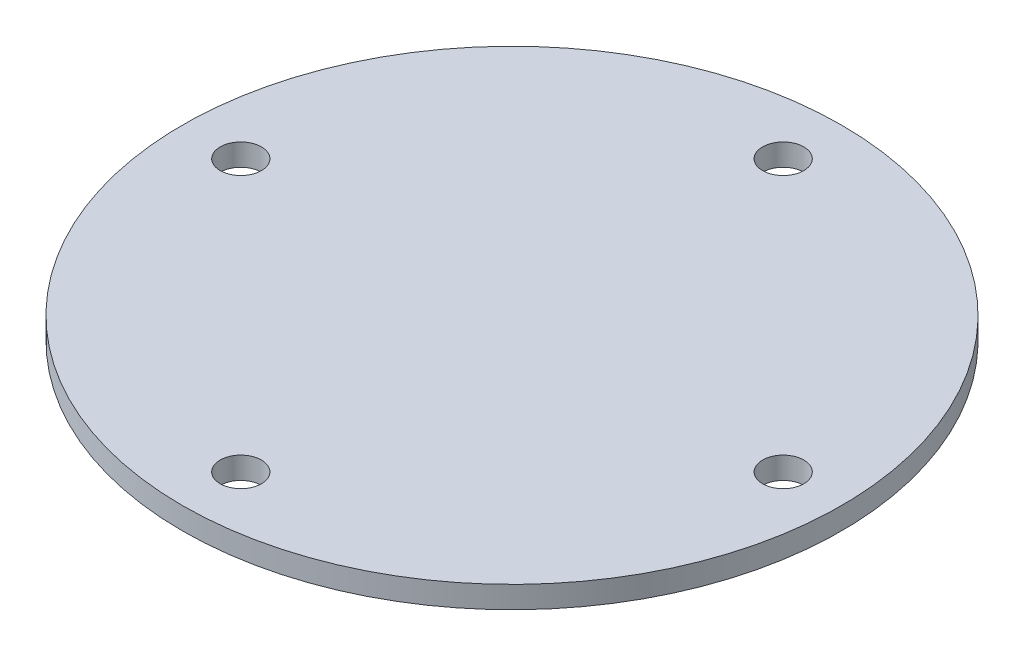
ISO-10303-21;
HEADER;
FILE_DESCRIPTION(('STEP AP214'),'2;1');
FILE_NAME('part.step','',(''),(''),'','','');
FILE_SCHEMA(('AUTOMOTIVE_DESIGN { 1 0 10303 214 1 1 1 1 }'));
ENDSEC;
DATA;
#1=APPLICATION_CONTEXT('core data for automotive mechanical design processes');
#2=APPLICATION_PROTOCOL_DEFINITION('international standard','automotive_design',2000,#1);
#3=PRODUCT_CONTEXT('',#1,'mechanical');
#4=PRODUCT('Part','Part','',(#3));
#5=PRODUCT_RELATED_PRODUCT_CATEGORY('part','',(#4));
#6=PRODUCT_DEFINITION_FORMATION('','',#4);
#7=PRODUCT_DEFINITION_CONTEXT('part definition',#1,'design');
#8=PRODUCT_DEFINITION('design','',#6,#7);
#9=PRODUCT_DEFINITION_SHAPE('','',#8);
#10=(LENGTH_UNIT() NAMED_UNIT(*) SI_UNIT(.MILLI.,.METRE.));
#11=(NAMED_UNIT(*) PLANE_ANGLE_UNIT() SI_UNIT($,.RADIAN.));
#12=(NAMED_UNIT(*) SI_UNIT($,.STERADIAN.) SOLID_ANGLE_UNIT());
#13=UNCERTAINTY_MEASURE_WITH_UNIT(LENGTH_MEASURE(1.E-05),#10,'distance_accuracy_value','');
#14=(GEOMETRIC_REPRESENTATION_CONTEXT(3) GLOBAL_UNCERTAINTY_ASSIGNED_CONTEXT((#13)) GLOBAL_UNIT_ASSIGNED_CONTEXT((#10,
#11,#12)) REPRESENTATION_CONTEXT('',''));
#15=CARTESIAN_POINT('',(0.,0.,0.));
#16=DIRECTION('',(0.,0.,1.));
#17=DIRECTION('',(1.,0.,0.));
#18=AXIS2_PLACEMENT_3D('',#15,#16,#17);
#19=CARTESIAN_POINT('',(0.,0.8,-19.75));
#20=DIRECTION('',(0.,-1.,0.));
#21=DIRECTION('',(0.,0.,-1.));
#22=AXIS2_PLACEMENT_3D('',#19,#20,#21);
#23=CYLINDRICAL_SURFACE('',#22,1.50000000000007);
#24=CARTESIAN_POINT('',(0.,0.8,-19.75));
#25=DIRECTION('',(0.,1.,0.));
#26=DIRECTION('',(0.,0.,1.));
#27=AXIS2_PLACEMENT_3D('',#24,#25,#26);
#28=CIRCLE('',#27,1.50000000000007);
#29=CARTESIAN_POINT('',(0.,0.8,-18.2499999999999));
#30=VERTEX_POINT('',#29);
#31=EDGE_CURVE('E39',#30,#30,#28,.T.);
#32=ORIENTED_EDGE('',*,*,#31,.T.);
#33=EDGE_LOOP('',(#32));
#34=FACE_BOUND('',#33,.T.);
#35=CARTESIAN_POINT('',(0.,-0.8,-19.75));
#36=DIRECTION('',(0.,1.,0.));
#37=DIRECTION('',(0.,0.,1.));
#38=AXIS2_PLACEMENT_3D('',#35,#36,#37);
#39=CIRCLE('',#38,1.50000000000007);
#40=CARTESIAN_POINT('',(0.,-0.8,-18.2499999999999));
#41=VERTEX_POINT('',#40);
#42=EDGE_CURVE('E56',#41,#41,#39,.T.);
#43=ORIENTED_EDGE('',*,*,#42,.F.);
#44=EDGE_LOOP('',(#43));
#45=FACE_BOUND('',#44,.T.);
#46=ADVANCED_FACE('F31',(#34,#45),#23,.F.);
#47=CARTESIAN_POINT('',(19.75,0.8,0.));
#48=DIRECTION('',(0.,-1.,0.));
#49=DIRECTION('',(0.,0.,-1.));
#50=AXIS2_PLACEMENT_3D('',#47,#48,#49);
#51=CYLINDRICAL_SURFACE('',#50,1.5);
#52=CARTESIAN_POINT('',(19.75,0.8,0.));
#53=DIRECTION('',(0.,1.,0.));
#54=DIRECTION('',(0.,0.,1.));
#55=AXIS2_PLACEMENT_3D('',#52,#53,#54);
#56=CIRCLE('',#55,1.5);
#57=CARTESIAN_POINT('',(19.75,0.8,1.50000000000007));
#58=VERTEX_POINT('',#57);
#59=EDGE_CURVE('E44',#58,#58,#56,.T.);
#60=ORIENTED_EDGE('',*,*,#59,.T.);
#61=EDGE_LOOP('',(#60));
#62=FACE_BOUND('',#61,.T.);
#63=CARTESIAN_POINT('',(19.75,-0.8,0.));
#64=DIRECTION('',(0.,1.,0.));
#65=DIRECTION('',(0.,0.,1.));
#66=AXIS2_PLACEMENT_3D('',#63,#64,#65);
#67=CIRCLE('',#66,1.5);
#68=CARTESIAN_POINT('',(19.75,-0.8,1.50000000000007));
#69=VERTEX_POINT('',#68);
#70=EDGE_CURVE('E54',#69,#69,#67,.T.);
#71=ORIENTED_EDGE('',*,*,#70,.F.);
#72=EDGE_LOOP('',(#71));
#73=FACE_BOUND('',#72,.T.);
#74=ADVANCED_FACE('F74',(#62,#73),#51,.F.);
#75=CARTESIAN_POINT('',(0.,0.8,19.75));
#76=DIRECTION('',(0.,-1.,0.));
#77=DIRECTION('',(0.,0.,-1.));
#78=AXIS2_PLACEMENT_3D('',#75,#76,#77);
#79=CYLINDRICAL_SURFACE('',#78,1.49999999999993);
#80=CARTESIAN_POINT('',(0.,0.8,19.75));
#81=DIRECTION('',(0.,1.,0.));
#82=DIRECTION('',(0.,0.,1.));
#83=AXIS2_PLACEMENT_3D('',#80,#81,#82);
#84=CIRCLE('',#83,1.49999999999993);
#85=CARTESIAN_POINT('',(0.,0.8,21.2499999999999));
#86=VERTEX_POINT('',#85);
#87=EDGE_CURVE('E65',#86,#86,#84,.T.);
#88=ORIENTED_EDGE('',*,*,#87,.T.);
#89=EDGE_LOOP('',(#88));
#90=FACE_BOUND('',#89,.T.);
#91=CARTESIAN_POINT('',(0.,-0.8,19.75));
#92=DIRECTION('',(0.,1.,0.));
#93=DIRECTION('',(0.,0.,1.));
#94=AXIS2_PLACEMENT_3D('',#91,#92,#93);
#95=CIRCLE('',#94,1.49999999999993);
#96=CARTESIAN_POINT('',(0.,-0.8,21.2499999999999));
#97=VERTEX_POINT('',#96);
#98=EDGE_CURVE('E51',#97,#97,#95,.T.);
#99=ORIENTED_EDGE('',*,*,#98,.F.);
#100=EDGE_LOOP('',(#99));
#101=FACE_BOUND('',#100,.T.);
#102=ADVANCED_FACE('F92',(#90,#101),#79,.F.);
#103=CARTESIAN_POINT('',(-19.75,0.8,0.));
#104=DIRECTION('',(0.,-1.,0.));
#105=DIRECTION('',(0.,0.,-1.));
#106=AXIS2_PLACEMENT_3D('',#103,#104,#105);
#107=CYLINDRICAL_SURFACE('',#106,1.5);
#108=CARTESIAN_POINT('',(-19.75,0.8,0.));
#109=DIRECTION('',(0.,1.,0.));
#110=DIRECTION('',(0.,0.,1.));
#111=AXIS2_PLACEMENT_3D('',#108,#109,#110);
#112=CIRCLE('',#111,1.5);
#113=CARTESIAN_POINT('',(-19.75,0.8,1.49999999999994));
#114=VERTEX_POINT('',#113);
#115=EDGE_CURVE('E61',#114,#114,#112,.T.);
#116=ORIENTED_EDGE('',*,*,#115,.T.);
#117=EDGE_LOOP('',(#116));
#118=FACE_BOUND('',#117,.T.);
#119=CARTESIAN_POINT('',(-19.75,-0.8,0.));
#120=DIRECTION('',(0.,1.,0.));
#121=DIRECTION('',(0.,0.,1.));
#122=AXIS2_PLACEMENT_3D('',#119,#120,#121);
#123=CIRCLE('',#122,1.5);
#124=CARTESIAN_POINT('',(-19.75,-0.8,1.49999999999994));
#125=VERTEX_POINT('',#124);
#126=EDGE_CURVE('E48',#125,#125,#123,.T.);
#127=ORIENTED_EDGE('',*,*,#126,.F.);
#128=EDGE_LOOP('',(#127));
#129=FACE_BOUND('',#128,.T.);
#130=ADVANCED_FACE('F33',(#118,#129),#107,.F.);
#131=CARTESIAN_POINT('',(0.,0.8,0.));
#132=DIRECTION('',(0.,-1.,0.));
#133=DIRECTION('',(0.,0.,-1.));
#134=AXIS2_PLACEMENT_3D('',#131,#132,#133);
#135=CYLINDRICAL_SURFACE('',#134,24.);
#136=CARTESIAN_POINT('',(0.,0.8,0.));
#137=DIRECTION('',(0.,1.,0.));
#138=DIRECTION('',(0.,0.,1.));
#139=AXIS2_PLACEMENT_3D('',#136,#137,#138);
#140=CIRCLE('',#139,24.);
#141=CARTESIAN_POINT('',(0.,0.8,24.));
#142=VERTEX_POINT('',#141);
#143=EDGE_CURVE('E10',#142,#142,#140,.T.);
#144=ORIENTED_EDGE('',*,*,#143,.F.);
#145=EDGE_LOOP('',(#144));
#146=FACE_BOUND('',#145,.T.);
#147=CARTESIAN_POINT('',(0.,-0.8,0.));
#148=DIRECTION('',(0.,1.,0.));
#149=DIRECTION('',(0.,0.,1.));
#150=AXIS2_PLACEMENT_3D('',#147,#148,#149);
#151=CIRCLE('',#150,24.);
#152=CARTESIAN_POINT('',(0.,-0.8,24.));
#153=VERTEX_POINT('',#152);
#154=EDGE_CURVE('E35',#153,#153,#151,.T.);
#155=ORIENTED_EDGE('',*,*,#154,.T.);
#156=EDGE_LOOP('',(#155));
#157=FACE_BOUND('',#156,.T.);
#158=ADVANCED_FACE('F81',(#146,#157),#135,.T.);
#159=CARTESIAN_POINT('',(0.,0.8,0.));
#160=DIRECTION('',(0.,1.,0.));
#161=DIRECTION('',(0.,0.,1.));
#162=AXIS2_PLACEMENT_3D('',#159,#160,#161);
#163=PLANE('',#162);
#164=ORIENTED_EDGE('',*,*,#115,.F.);
#165=EDGE_LOOP('',(#164));
#166=FACE_BOUND('',#165,.T.);
#167=ORIENTED_EDGE('',*,*,#87,.F.);
#168=EDGE_LOOP('',(#167));
#169=FACE_BOUND('',#168,.T.);
#170=ORIENTED_EDGE('',*,*,#59,.F.);
#171=EDGE_LOOP('',(#170));
#172=FACE_BOUND('',#171,.T.);
#173=ORIENTED_EDGE('',*,*,#31,.F.);
#174=EDGE_LOOP('',(#173));
#175=FACE_BOUND('',#174,.T.);
#176=ORIENTED_EDGE('',*,*,#143,.T.);
#177=EDGE_LOOP('',(#176));
#178=FACE_BOUND('',#177,.T.);
#179=ADVANCED_FACE('F77',(#166,#169,#172,#175,#178),#163,.T.);
#180=CARTESIAN_POINT('',(0.,-0.8,0.));
#181=DIRECTION('',(0.,1.,0.));
#182=DIRECTION('',(0.,0.,1.));
#183=AXIS2_PLACEMENT_3D('',#180,#181,#182);
#184=PLANE('',#183);
#185=ORIENTED_EDGE('',*,*,#126,.T.);
#186=EDGE_LOOP('',(#185));
#187=FACE_BOUND('',#186,.T.);
#188=ORIENTED_EDGE('',*,*,#98,.T.);
#189=EDGE_LOOP('',(#188));
#190=FACE_BOUND('',#189,.T.);
#191=ORIENTED_EDGE('',*,*,#70,.T.);
#192=EDGE_LOOP('',(#191));
#193=FACE_BOUND('',#192,.T.);
#194=ORIENTED_EDGE('',*,*,#42,.T.);
#195=EDGE_LOOP('',(#194));
#196=FACE_BOUND('',#195,.T.);
#197=ORIENTED_EDGE('',*,*,#154,.F.);
#198=EDGE_LOOP('',(#197));
#199=FACE_BOUND('',#198,.T.);
#200=ADVANCED_FACE('F80',(#187,#190,#193,#196,#199),#184,.F.);
#201=CLOSED_SHELL('',(#46,#74,#102,#130,#158,#179,#200));
#202=MANIFOLD_SOLID_BREP('B2',#201);
#203=ADVANCED_BREP_SHAPE_REPRESENTATION('',(#18,#202),#14);
#204=SHAPE_DEFINITION_REPRESENTATION(#9,#203);
ENDSEC;
END-ISO-10303-21;
